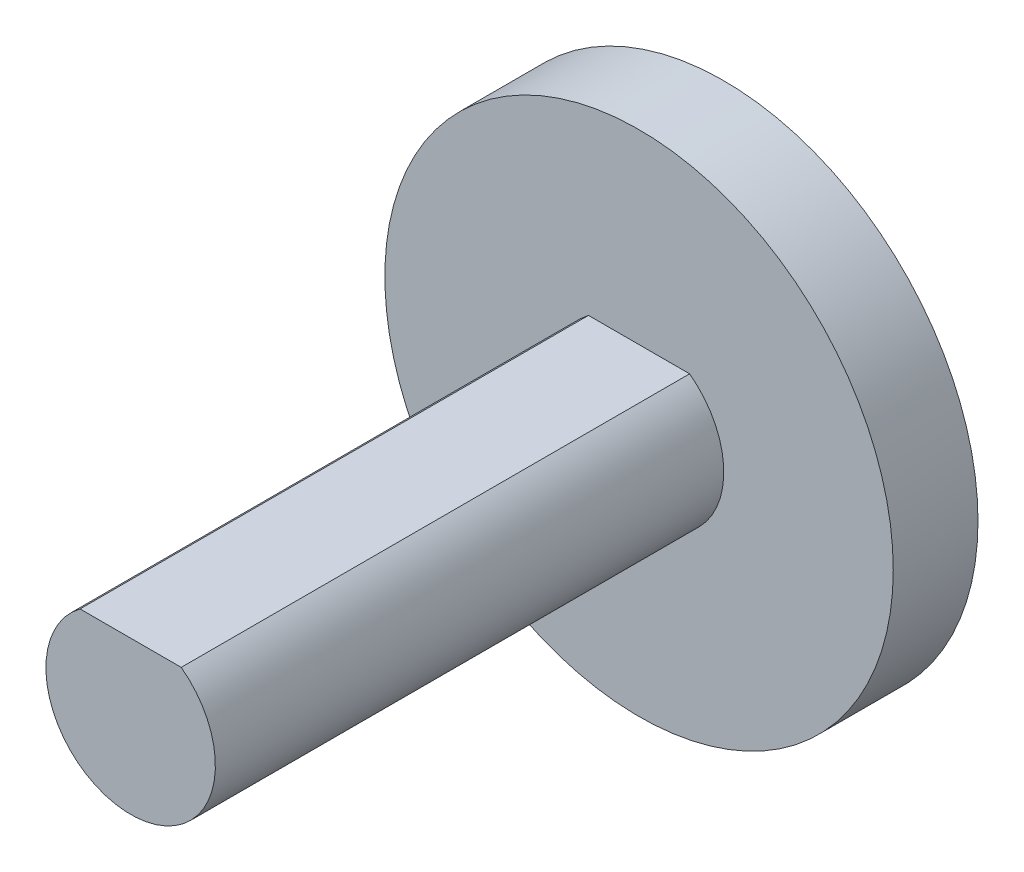
ISO-10303-21;
HEADER;
FILE_DESCRIPTION(('STEP AP214'),'2;1');
FILE_NAME('part.step','',(''),(''),'','','');
FILE_SCHEMA(('AUTOMOTIVE_DESIGN { 1 0 10303 214 1 1 1 1 }'));
ENDSEC;
DATA;
#1=APPLICATION_CONTEXT('core data for automotive mechanical design processes');
#2=APPLICATION_PROTOCOL_DEFINITION('international standard','automotive_design',2000,#1);
#3=PRODUCT_CONTEXT('',#1,'mechanical');
#4=PRODUCT('Part','Part','',(#3));
#5=PRODUCT_RELATED_PRODUCT_CATEGORY('part','',(#4));
#6=PRODUCT_DEFINITION_FORMATION('','',#4);
#7=PRODUCT_DEFINITION_CONTEXT('part definition',#1,'design');
#8=PRODUCT_DEFINITION('design','',#6,#7);
#9=PRODUCT_DEFINITION_SHAPE('','',#8);
#10=(LENGTH_UNIT() NAMED_UNIT(*) SI_UNIT(.MILLI.,.METRE.));
#11=(NAMED_UNIT(*) PLANE_ANGLE_UNIT() SI_UNIT($,.RADIAN.));
#12=(NAMED_UNIT(*) SI_UNIT($,.STERADIAN.) SOLID_ANGLE_UNIT());
#13=UNCERTAINTY_MEASURE_WITH_UNIT(LENGTH_MEASURE(1.E-05),#10,'distance_accuracy_value','');
#14=(GEOMETRIC_REPRESENTATION_CONTEXT(3) GLOBAL_UNCERTAINTY_ASSIGNED_CONTEXT((#13)) GLOBAL_UNIT_ASSIGNED_CONTEXT((#10,
#11,#12)) REPRESENTATION_CONTEXT('',''));
#15=CARTESIAN_POINT('',(0.,0.,0.));
#16=DIRECTION('',(0.,0.,1.));
#17=DIRECTION('',(1.,0.,0.));
#18=AXIS2_PLACEMENT_3D('',#15,#16,#17);
#19=CARTESIAN_POINT('',(0.,0.,2.5));
#20=DIRECTION('',(0.,0.,1.));
#21=DIRECTION('',(1.,0.,0.));
#22=AXIS2_PLACEMENT_3D('',#19,#20,#21);
#23=PLANE('',#22);
#24=CARTESIAN_POINT('',(0.,0.,2.5));
#25=DIRECTION('',(0.,0.,1.));
#26=DIRECTION('',(1.,0.,0.));
#27=AXIS2_PLACEMENT_3D('',#24,#25,#26);
#28=CIRCLE('',#27,7.5);
#29=CARTESIAN_POINT('',(7.5,0.,2.5));
#30=VERTEX_POINT('',#29);
#31=EDGE_CURVE('E11',#30,#30,#28,.T.);
#32=ORIENTED_EDGE('',*,*,#31,.T.);
#33=EDGE_LOOP('',(#32));
#34=FACE_BOUND('',#33,.T.);
#35=CARTESIAN_POINT('',(0.,0.,2.5));
#36=DIRECTION('',(0.,0.,1.));
#37=DIRECTION('',(1.,0.,0.));
#38=AXIS2_PLACEMENT_3D('',#35,#36,#37);
#39=CIRCLE('',#38,2.5);
#40=CARTESIAN_POINT('',(-1.49225011721491,2.00578901873355,2.5));
#41=VERTEX_POINT('',#40);
#42=CARTESIAN_POINT('',(1.49225011721491,2.00578901873355,2.5));
#43=VERTEX_POINT('',#42);
#44=EDGE_CURVE('E60',#41,#43,#39,.T.);
#45=ORIENTED_EDGE('',*,*,#44,.F.);
#46=DIRECTION('',(1.,0.,0.));
#47=VECTOR('',#46,1.);
#48=CARTESIAN_POINT('',(-1.49225011721491,2.00578901873355,2.5));
#49=LINE('',#48,#47);
#50=EDGE_CURVE('E73',#41,#43,#49,.T.);
#51=ORIENTED_EDGE('',*,*,#50,.T.);
#52=EDGE_LOOP('',(#45,#51));
#53=FACE_BOUND('',#52,.T.);
#54=ADVANCED_FACE('F45',(#34,#53),#23,.T.);
#55=CARTESIAN_POINT('',(0.,0.,2.5));
#56=DIRECTION('',(0.,0.,-1.));
#57=DIRECTION('',(-1.,0.,0.));
#58=AXIS2_PLACEMENT_3D('',#55,#56,#57);
#59=CYLINDRICAL_SURFACE('',#58,7.5);
#60=ORIENTED_EDGE('',*,*,#31,.F.);
#61=EDGE_LOOP('',(#60));
#62=FACE_BOUND('',#61,.T.);
#63=CARTESIAN_POINT('',(0.,0.,0.));
#64=DIRECTION('',(0.,0.,1.));
#65=DIRECTION('',(1.,0.,0.));
#66=AXIS2_PLACEMENT_3D('',#63,#64,#65);
#67=CIRCLE('',#66,7.5);
#68=CARTESIAN_POINT('',(7.5,0.,0.));
#69=VERTEX_POINT('',#68);
#70=EDGE_CURVE('E49',#69,#69,#67,.T.);
#71=ORIENTED_EDGE('',*,*,#70,.T.);
#72=EDGE_LOOP('',(#71));
#73=FACE_BOUND('',#72,.T.);
#74=ADVANCED_FACE('F47',(#62,#73),#59,.T.);
#75=CARTESIAN_POINT('',(0.,0.,0.));
#76=DIRECTION('',(0.,0.,1.));
#77=DIRECTION('',(1.,0.,0.));
#78=AXIS2_PLACEMENT_3D('',#75,#76,#77);
#79=PLANE('',#78);
#80=ORIENTED_EDGE('',*,*,#70,.F.);
#81=EDGE_LOOP('',(#80));
#82=FACE_BOUND('',#81,.T.);
#83=ADVANCED_FACE('F99',(#82),#79,.F.);
#84=CARTESIAN_POINT('',(-1.49225011721491,2.00578901873355,17.5));
#85=DIRECTION('',(0.,1.,0.));
#86=DIRECTION('',(0.,0.,1.));
#87=AXIS2_PLACEMENT_3D('',#84,#85,#86);
#88=PLANE('',#87);
#89=ORIENTED_EDGE('',*,*,#50,.F.);
#90=DIRECTION('',(0.,0.,-1.));
#91=VECTOR('',#90,1.);
#92=CARTESIAN_POINT('',(-1.49225011721491,2.00578901873355,17.5));
#93=LINE('',#92,#91);
#94=CARTESIAN_POINT('',(-1.49225011721491,2.00578901873355,17.5));
#95=VERTEX_POINT('',#94);
#96=EDGE_CURVE('E68',#95,#41,#93,.T.);
#97=ORIENTED_EDGE('',*,*,#96,.F.);
#98=DIRECTION('',(1.,0.,0.));
#99=VECTOR('',#98,1.);
#100=CARTESIAN_POINT('',(-1.49225011721491,2.00578901873355,17.5));
#101=LINE('',#100,#99);
#102=CARTESIAN_POINT('',(1.49225011721491,2.00578901873355,17.5));
#103=VERTEX_POINT('',#102);
#104=EDGE_CURVE('E81',#95,#103,#101,.T.);
#105=ORIENTED_EDGE('',*,*,#104,.T.);
#106=DIRECTION('',(0.,0.,-1.));
#107=VECTOR('',#106,1.);
#108=CARTESIAN_POINT('',(1.49225011721491,2.00578901873355,17.5));
#109=LINE('',#108,#107);
#110=EDGE_CURVE('E78',#103,#43,#109,.T.);
#111=ORIENTED_EDGE('',*,*,#110,.T.);
#112=EDGE_LOOP('',(#89,#97,#105,#111));
#113=FACE_BOUND('',#112,.T.);
#114=ADVANCED_FACE('F79',(#113),#88,.T.);
#115=CARTESIAN_POINT('',(0.,0.,17.5));
#116=DIRECTION('',(0.,0.,-1.));
#117=DIRECTION('',(-1.,0.,0.));
#118=AXIS2_PLACEMENT_3D('',#115,#116,#117);
#119=CYLINDRICAL_SURFACE('',#118,2.5);
#120=ORIENTED_EDGE('',*,*,#44,.T.);
#121=ORIENTED_EDGE('',*,*,#110,.F.);
#122=CARTESIAN_POINT('',(0.,0.,17.5));
#123=DIRECTION('',(0.,0.,1.));
#124=DIRECTION('',(1.,0.,0.));
#125=AXIS2_PLACEMENT_3D('',#122,#123,#124);
#126=CIRCLE('',#125,2.5);
#127=EDGE_CURVE('E84',#95,#103,#126,.T.);
#128=ORIENTED_EDGE('',*,*,#127,.F.);
#129=ORIENTED_EDGE('',*,*,#96,.T.);
#130=EDGE_LOOP('',(#120,#121,#128,#129));
#131=FACE_BOUND('',#130,.T.);
#132=ADVANCED_FACE('F86',(#131),#119,.T.);
#133=CARTESIAN_POINT('',(0.,0.,17.5));
#134=DIRECTION('',(0.,0.,1.));
#135=DIRECTION('',(1.,0.,0.));
#136=AXIS2_PLACEMENT_3D('',#133,#134,#135);
#137=PLANE('',#136);
#138=ORIENTED_EDGE('',*,*,#104,.F.);
#139=ORIENTED_EDGE('',*,*,#127,.T.);
#140=EDGE_LOOP('',(#138,#139));
#141=FACE_BOUND('',#140,.T.);
#142=ADVANCED_FACE('F115',(#141),#137,.T.);
#143=CLOSED_SHELL('',(#54,#74,#83,#114,#132,#142));
#144=MANIFOLD_SOLID_BREP('B2',#143);
#145=ADVANCED_BREP_SHAPE_REPRESENTATION('',(#18,#144),#14);
#146=SHAPE_DEFINITION_REPRESENTATION(#9,#145);
ENDSEC;
END-ISO-10303-21;
